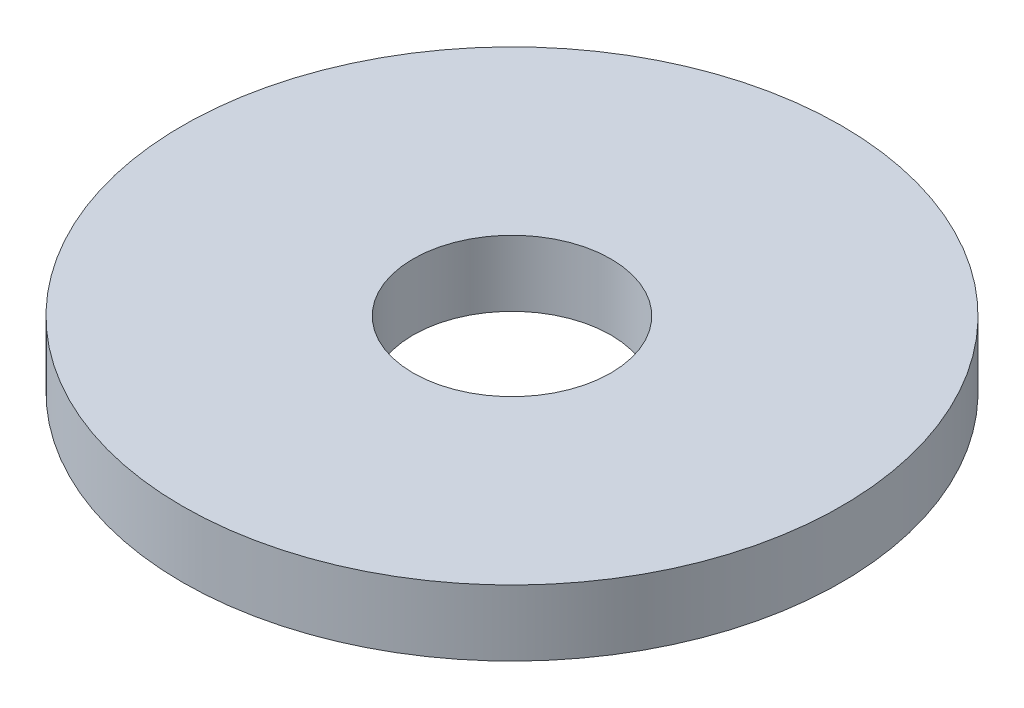
ISO-10303-21;
HEADER;
FILE_DESCRIPTION(('STEP AP214'),'2;1');
FILE_NAME('part.step','',(''),(''),'','','');
FILE_SCHEMA(('AUTOMOTIVE_DESIGN { 1 0 10303 214 1 1 1 1 }'));
ENDSEC;
DATA;
#1=APPLICATION_CONTEXT('core data for automotive mechanical design processes');
#2=APPLICATION_PROTOCOL_DEFINITION('international standard','automotive_design',2000,#1);
#3=PRODUCT_CONTEXT('',#1,'mechanical');
#4=PRODUCT('Part','Part','',(#3));
#5=PRODUCT_RELATED_PRODUCT_CATEGORY('part','',(#4));
#6=PRODUCT_DEFINITION_FORMATION('','',#4);
#7=PRODUCT_DEFINITION_CONTEXT('part definition',#1,'design');
#8=PRODUCT_DEFINITION('design','',#6,#7);
#9=PRODUCT_DEFINITION_SHAPE('','',#8);
#10=(LENGTH_UNIT() NAMED_UNIT(*) SI_UNIT(.MILLI.,.METRE.));
#11=(NAMED_UNIT(*) PLANE_ANGLE_UNIT() SI_UNIT($,.RADIAN.));
#12=(NAMED_UNIT(*) SI_UNIT($,.STERADIAN.) SOLID_ANGLE_UNIT());
#13=UNCERTAINTY_MEASURE_WITH_UNIT(LENGTH_MEASURE(1.E-05),#10,'distance_accuracy_value','');
#14=(GEOMETRIC_REPRESENTATION_CONTEXT(3) GLOBAL_UNCERTAINTY_ASSIGNED_CONTEXT((#13)) GLOBAL_UNIT_ASSIGNED_CONTEXT((#10,
#11,#12)) REPRESENTATION_CONTEXT('',''));
#15=CARTESIAN_POINT('',(0.,0.,0.));
#16=DIRECTION('',(0.,0.,1.));
#17=DIRECTION('',(1.,0.,0.));
#18=AXIS2_PLACEMENT_3D('',#15,#16,#17);
#19=CARTESIAN_POINT('',(0.,1.,0.));
#20=DIRECTION('',(0.,1.,0.));
#21=DIRECTION('',(0.,0.,1.));
#22=AXIS2_PLACEMENT_3D('',#19,#20,#21);
#23=PLANE('',#22);
#24=CARTESIAN_POINT('',(0.,1.,0.));
#25=DIRECTION('',(0.,1.,0.));
#26=DIRECTION('',(0.,0.,1.));
#27=AXIS2_PLACEMENT_3D('',#24,#25,#26);
#28=CIRCLE('',#27,5.);
#29=CARTESIAN_POINT('',(0.,1.,5.));
#30=VERTEX_POINT('',#29);
#31=EDGE_CURVE('E10',#30,#30,#28,.T.);
#32=ORIENTED_EDGE('',*,*,#31,.T.);
#33=EDGE_LOOP('',(#32));
#34=FACE_BOUND('',#33,.T.);
#35=CARTESIAN_POINT('',(0.,1.,0.));
#36=DIRECTION('',(0.,1.,0.));
#37=DIRECTION('',(0.,0.,1.));
#38=AXIS2_PLACEMENT_3D('',#35,#36,#37);
#39=CIRCLE('',#38,1.5);
#40=CARTESIAN_POINT('',(0.,1.,1.5));
#41=VERTEX_POINT('',#40);
#42=EDGE_CURVE('E44',#41,#41,#39,.T.);
#43=ORIENTED_EDGE('',*,*,#42,.F.);
#44=EDGE_LOOP('',(#43));
#45=FACE_BOUND('',#44,.T.);
#46=ADVANCED_FACE('F33',(#34,#45),#23,.T.);
#47=CARTESIAN_POINT('',(0.,0.,0.));
#48=DIRECTION('',(0.,1.,0.));
#49=DIRECTION('',(0.,0.,1.));
#50=AXIS2_PLACEMENT_3D('',#47,#48,#49);
#51=PLANE('',#50);
#52=CARTESIAN_POINT('',(0.,0.,0.));
#53=DIRECTION('',(0.,1.,0.));
#54=DIRECTION('',(0.,0.,1.));
#55=AXIS2_PLACEMENT_3D('',#52,#53,#54);
#56=CIRCLE('',#55,5.);
#57=CARTESIAN_POINT('',(0.,0.,5.));
#58=VERTEX_POINT('',#57);
#59=EDGE_CURVE('E37',#58,#58,#56,.T.);
#60=ORIENTED_EDGE('',*,*,#59,.F.);
#61=EDGE_LOOP('',(#60));
#62=FACE_BOUND('',#61,.T.);
#63=CARTESIAN_POINT('',(0.,0.,0.));
#64=DIRECTION('',(0.,1.,0.));
#65=DIRECTION('',(0.,0.,1.));
#66=AXIS2_PLACEMENT_3D('',#63,#64,#65);
#67=CIRCLE('',#66,1.5);
#68=CARTESIAN_POINT('',(0.,0.,1.5));
#69=VERTEX_POINT('',#68);
#70=EDGE_CURVE('E46',#69,#69,#67,.T.);
#71=ORIENTED_EDGE('',*,*,#70,.T.);
#72=EDGE_LOOP('',(#71));
#73=FACE_BOUND('',#72,.T.);
#74=ADVANCED_FACE('F56',(#62,#73),#51,.F.);
#75=CARTESIAN_POINT('',(0.,1.,0.));
#76=DIRECTION('',(0.,-1.,0.));
#77=DIRECTION('',(0.,0.,-1.));
#78=AXIS2_PLACEMENT_3D('',#75,#76,#77);
#79=CYLINDRICAL_SURFACE('',#78,5.);
#80=ORIENTED_EDGE('',*,*,#31,.F.);
#81=EDGE_LOOP('',(#80));
#82=FACE_BOUND('',#81,.T.);
#83=ORIENTED_EDGE('',*,*,#59,.T.);
#84=EDGE_LOOP('',(#83));
#85=FACE_BOUND('',#84,.T.);
#86=ADVANCED_FACE('F35',(#82,#85),#79,.T.);
#87=CARTESIAN_POINT('',(0.,1.,0.));
#88=DIRECTION('',(0.,-1.,0.));
#89=DIRECTION('',(0.,0.,-1.));
#90=AXIS2_PLACEMENT_3D('',#87,#88,#89);
#91=CYLINDRICAL_SURFACE('',#90,1.5);
#92=ORIENTED_EDGE('',*,*,#42,.T.);
#93=EDGE_LOOP('',(#92));
#94=FACE_BOUND('',#93,.T.);
#95=ORIENTED_EDGE('',*,*,#70,.F.);
#96=EDGE_LOOP('',(#95));
#97=FACE_BOUND('',#96,.T.);
#98=ADVANCED_FACE('F52',(#94,#97),#91,.F.);
#99=CLOSED_SHELL('',(#46,#74,#86,#98));
#100=MANIFOLD_SOLID_BREP('B2',#99);
#101=ADVANCED_BREP_SHAPE_REPRESENTATION('',(#18,#100),#14);
#102=SHAPE_DEFINITION_REPRESENTATION(#9,#101);
ENDSEC;
END-ISO-10303-21;
